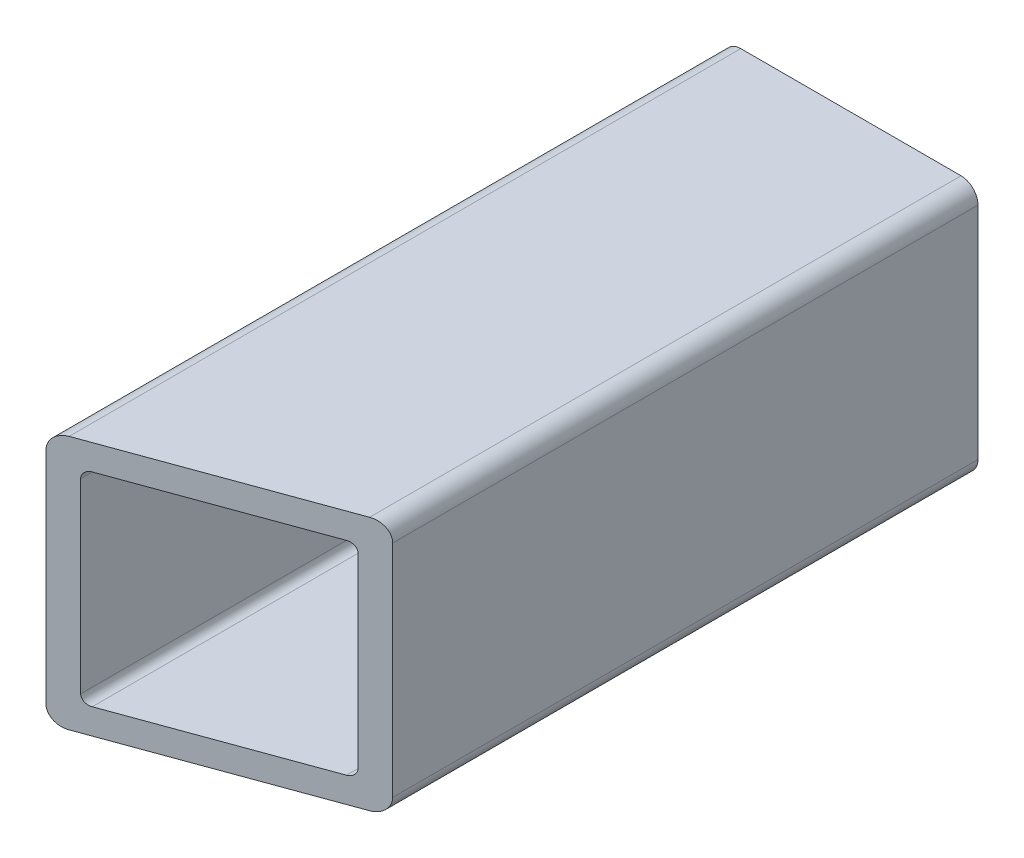
ISO-10303-21;
HEADER;
FILE_DESCRIPTION(('STEP AP214'),'2;1');
FILE_NAME('part.step','',(''),(''),'','','');
FILE_SCHEMA(('AUTOMOTIVE_DESIGN { 1 0 10303 214 1 1 1 1 }'));
ENDSEC;
DATA;
#1=APPLICATION_CONTEXT('core data for automotive mechanical design processes');
#2=APPLICATION_PROTOCOL_DEFINITION('international standard','automotive_design',2000,#1);
#3=PRODUCT_CONTEXT('',#1,'mechanical');
#4=PRODUCT('Part','Part','',(#3));
#5=PRODUCT_RELATED_PRODUCT_CATEGORY('part','',(#4));
#6=PRODUCT_DEFINITION_FORMATION('','',#4);
#7=PRODUCT_DEFINITION_CONTEXT('part definition',#1,'design');
#8=PRODUCT_DEFINITION('design','',#6,#7);
#9=PRODUCT_DEFINITION_SHAPE('','',#8);
#10=(LENGTH_UNIT() NAMED_UNIT(*) SI_UNIT(.MILLI.,.METRE.));
#11=(NAMED_UNIT(*) PLANE_ANGLE_UNIT() SI_UNIT($,.RADIAN.));
#12=(NAMED_UNIT(*) SI_UNIT($,.STERADIAN.) SOLID_ANGLE_UNIT());
#13=UNCERTAINTY_MEASURE_WITH_UNIT(LENGTH_MEASURE(1.E-05),#10,'distance_accuracy_value','');
#14=(GEOMETRIC_REPRESENTATION_CONTEXT(3) GLOBAL_UNCERTAINTY_ASSIGNED_CONTEXT((#13)) GLOBAL_UNIT_ASSIGNED_CONTEXT((#10,
#11,#12)) REPRESENTATION_CONTEXT('',''));
#15=CARTESIAN_POINT('',(0.,0.,0.));
#16=DIRECTION('',(0.,0.,1.));
#17=DIRECTION('',(1.,0.,0.));
#18=AXIS2_PLACEMENT_3D('',#15,#16,#17);
#19=CARTESIAN_POINT('',(-13.,-0.999999999999999,0.));
#20=DIRECTION('',(0.,0.,1.));
#21=DIRECTION('',(1.,0.,0.));
#22=AXIS2_PLACEMENT_3D('',#19,#20,#21);
#23=PLANE('',#22);
#24=CARTESIAN_POINT('',(-13.,-0.999999999999999,0.));
#25=DIRECTION('',(0.,0.,1.));
#26=DIRECTION('',(1.,0.,0.));
#27=AXIS2_PLACEMENT_3D('',#24,#25,#26);
#28=CIRCLE('',#27,2.);
#29=CARTESIAN_POINT('',(-15.,-0.999999999999999,0.));
#30=VERTEX_POINT('',#29);
#31=CARTESIAN_POINT('',(-13.,-3.,0.));
#32=VERTEX_POINT('',#31);
#33=EDGE_CURVE('E172',#30,#32,#28,.T.);
#34=ORIENTED_EDGE('',*,*,#33,.F.);
#35=DIRECTION('',(0.,-1.,0.));
#36=VECTOR('',#35,1.);
#37=CARTESIAN_POINT('',(-15.,-0.999999999999999,0.));
#38=LINE('',#37,#36);
#39=CARTESIAN_POINT('',(-15.,25.,0.));
#40=VERTEX_POINT('',#39);
#41=EDGE_CURVE('E188',#40,#30,#38,.T.);
#42=ORIENTED_EDGE('',*,*,#41,.F.);
#43=CARTESIAN_POINT('',(-13.,25.,0.));
#44=DIRECTION('',(0.,0.,1.));
#45=DIRECTION('',(1.,0.,0.));
#46=AXIS2_PLACEMENT_3D('',#43,#44,#45);
#47=CIRCLE('',#46,2.);
#48=CARTESIAN_POINT('',(-13.,27.,0.));
#49=VERTEX_POINT('',#48);
#50=EDGE_CURVE('E190',#49,#40,#47,.T.);
#51=ORIENTED_EDGE('',*,*,#50,.F.);
#52=DIRECTION('',(-1.,0.,0.));
#53=VECTOR('',#52,1.);
#54=CARTESIAN_POINT('',(-13.,27.,0.));
#55=LINE('',#54,#53);
#56=CARTESIAN_POINT('',(13.,27.,0.));
#57=VERTEX_POINT('',#56);
#58=EDGE_CURVE('E192',#57,#49,#55,.T.);
#59=ORIENTED_EDGE('',*,*,#58,.F.);
#60=CARTESIAN_POINT('',(13.,25.,0.));
#61=DIRECTION('',(0.,0.,1.));
#62=DIRECTION('',(1.,0.,0.));
#63=AXIS2_PLACEMENT_3D('',#60,#61,#62);
#64=CIRCLE('',#63,2.);
#65=CARTESIAN_POINT('',(15.,25.,0.));
#66=VERTEX_POINT('',#65);
#67=EDGE_CURVE('E195',#66,#57,#64,.T.);
#68=ORIENTED_EDGE('',*,*,#67,.F.);
#69=DIRECTION('',(0.,1.,0.));
#70=VECTOR('',#69,1.);
#71=CARTESIAN_POINT('',(15.,-0.999999999999999,0.));
#72=LINE('',#71,#70);
#73=CARTESIAN_POINT('',(15.,-0.999999999999999,0.));
#74=VERTEX_POINT('',#73);
#75=EDGE_CURVE('E198',#74,#66,#72,.T.);
#76=ORIENTED_EDGE('',*,*,#75,.F.);
#77=CARTESIAN_POINT('',(13.,-0.999999999999999,0.));
#78=DIRECTION('',(0.,0.,1.));
#79=DIRECTION('',(1.,0.,0.));
#80=AXIS2_PLACEMENT_3D('',#77,#78,#79);
#81=CIRCLE('',#80,2.);
#82=CARTESIAN_POINT('',(13.,-3.,0.));
#83=VERTEX_POINT('',#82);
#84=EDGE_CURVE('E201',#83,#74,#81,.T.);
#85=ORIENTED_EDGE('',*,*,#84,.F.);
#86=DIRECTION('',(1.,0.,0.));
#87=VECTOR('',#86,1.);
#88=CARTESIAN_POINT('',(-13.,-3.,0.));
#89=LINE('',#88,#87);
#90=EDGE_CURVE('E204',#32,#83,#89,.T.);
#91=ORIENTED_EDGE('',*,*,#90,.F.);
#92=EDGE_LOOP('',(#34,#42,#51,#59,#68,#76,#85,#91));
#93=FACE_BOUND('',#92,.T.);
#94=CARTESIAN_POINT('',(-11.,1.,0.));
#95=DIRECTION('',(0.,0.,1.));
#96=DIRECTION('',(1.,0.,0.));
#97=AXIS2_PLACEMENT_3D('',#94,#95,#96);
#98=CIRCLE('',#97,1.);
#99=CARTESIAN_POINT('',(-12.,1.,0.));
#100=VERTEX_POINT('',#99);
#101=CARTESIAN_POINT('',(-11.,0.,0.));
#102=VERTEX_POINT('',#101);
#103=EDGE_CURVE('E159',#100,#102,#98,.T.);
#104=ORIENTED_EDGE('',*,*,#103,.T.);
#105=DIRECTION('',(1.,0.,0.));
#106=VECTOR('',#105,1.);
#107=CARTESIAN_POINT('',(-11.,0.,0.));
#108=LINE('',#107,#106);
#109=CARTESIAN_POINT('',(11.,0.,0.));
#110=VERTEX_POINT('',#109);
#111=EDGE_CURVE('E241',#102,#110,#108,.T.);
#112=ORIENTED_EDGE('',*,*,#111,.T.);
#113=CARTESIAN_POINT('',(11.,1.,0.));
#114=DIRECTION('',(0.,0.,1.));
#115=DIRECTION('',(1.,0.,0.));
#116=AXIS2_PLACEMENT_3D('',#113,#114,#115);
#117=CIRCLE('',#116,1.);
#118=CARTESIAN_POINT('',(12.,1.,0.));
#119=VERTEX_POINT('',#118);
#120=EDGE_CURVE('E238',#110,#119,#117,.T.);
#121=ORIENTED_EDGE('',*,*,#120,.T.);
#122=DIRECTION('',(0.,1.,0.));
#123=VECTOR('',#122,1.);
#124=CARTESIAN_POINT('',(12.,1.,0.));
#125=LINE('',#124,#123);
#126=CARTESIAN_POINT('',(12.,23.,0.));
#127=VERTEX_POINT('',#126);
#128=EDGE_CURVE('E235',#119,#127,#125,.T.);
#129=ORIENTED_EDGE('',*,*,#128,.T.);
#130=CARTESIAN_POINT('',(11.,23.,0.));
#131=DIRECTION('',(0.,0.,1.));
#132=DIRECTION('',(1.,0.,0.));
#133=AXIS2_PLACEMENT_3D('',#130,#131,#132);
#134=CIRCLE('',#133,1.);
#135=CARTESIAN_POINT('',(11.,24.,0.));
#136=VERTEX_POINT('',#135);
#137=EDGE_CURVE('E232',#127,#136,#134,.T.);
#138=ORIENTED_EDGE('',*,*,#137,.T.);
#139=DIRECTION('',(-1.,0.,0.));
#140=VECTOR('',#139,1.);
#141=CARTESIAN_POINT('',(-11.,24.,0.));
#142=LINE('',#141,#140);
#143=CARTESIAN_POINT('',(-11.,24.,0.));
#144=VERTEX_POINT('',#143);
#145=EDGE_CURVE('E229',#136,#144,#142,.T.);
#146=ORIENTED_EDGE('',*,*,#145,.T.);
#147=CARTESIAN_POINT('',(-11.,23.,0.));
#148=DIRECTION('',(0.,0.,1.));
#149=DIRECTION('',(1.,0.,0.));
#150=AXIS2_PLACEMENT_3D('',#147,#148,#149);
#151=CIRCLE('',#150,1.);
#152=CARTESIAN_POINT('',(-12.,23.,0.));
#153=VERTEX_POINT('',#152);
#154=EDGE_CURVE('E226',#144,#153,#151,.T.);
#155=ORIENTED_EDGE('',*,*,#154,.T.);
#156=DIRECTION('',(0.,-1.,0.));
#157=VECTOR('',#156,1.);
#158=CARTESIAN_POINT('',(-12.,1.,0.));
#159=LINE('',#158,#157);
#160=EDGE_CURVE('E223',#153,#100,#159,.T.);
#161=ORIENTED_EDGE('',*,*,#160,.T.);
#162=EDGE_LOOP('',(#104,#112,#121,#129,#138,#146,#155,#161));
#163=FACE_BOUND('',#162,.T.);
#164=ADVANCED_FACE('F36',(#93,#163),#23,.F.);
#165=CARTESIAN_POINT('',(-13.,-0.999999999999999,80.));
#166=DIRECTION('',(0.,0.,-1.));
#167=DIRECTION('',(-1.,0.,0.));
#168=AXIS2_PLACEMENT_3D('',#165,#166,#167);
#169=CYLINDRICAL_SURFACE('',#168,2.);
#170=DIRECTION('',(0.,0.,-1.));
#171=VECTOR('',#170,1.);
#172=CARTESIAN_POINT('',(-13.,-3.,80.));
#173=LINE('',#172,#171);
#174=CARTESIAN_POINT('',(-13.,-3.,79.2720595314676));
#175=VERTEX_POINT('',#174);
#176=EDGE_CURVE('E44',#175,#32,#173,.T.);
#177=ORIENTED_EDGE('',*,*,#176,.F.);
#178=CARTESIAN_POINT('',(-13.,-0.999999999999999,79.2720595314676));
#179=DIRECTION('',(-0.342020143325669,0.,-0.939692620785908));
#180=DIRECTION('',(0.939692620785908,0.,-0.342020143325669));
#181=AXIS2_PLACEMENT_3D('',#178,#179,#180);
#182=ELLIPSE('',#181,2.12835554495182,2.);
#183=CARTESIAN_POINT('',(-15.,-1.,80.));
#184=VERTEX_POINT('',#183);
#185=EDGE_CURVE('E148',#175,#184,#182,.T.);
#186=ORIENTED_EDGE('',*,*,#185,.T.);
#187=DIRECTION('',(0.,0.,-1.));
#188=VECTOR('',#187,1.);
#189=CARTESIAN_POINT('',(-15.,-0.999999999999999,80.));
#190=LINE('',#189,#188);
#191=EDGE_CURVE('E186',#184,#30,#190,.T.);
#192=ORIENTED_EDGE('',*,*,#191,.T.);
#193=ORIENTED_EDGE('',*,*,#33,.T.);
#194=EDGE_LOOP('',(#177,#186,#192,#193));
#195=FACE_BOUND('',#194,.T.);
#196=ADVANCED_FACE('F38',(#195),#169,.T.);
#197=CARTESIAN_POINT('',(-13.,-3.,80.));
#198=DIRECTION('',(0.,1.,0.));
#199=DIRECTION('',(0.,0.,1.));
#200=AXIS2_PLACEMENT_3D('',#197,#198,#199);
#201=PLANE('',#200);
#202=DIRECTION('',(0.,0.,-1.));
#203=VECTOR('',#202,1.);
#204=CARTESIAN_POINT('',(13.,-3.,80.));
#205=LINE('',#204,#203);
#206=CARTESIAN_POINT('',(13.,-3.,69.8088334405463));
#207=VERTEX_POINT('',#206);
#208=EDGE_CURVE('E167',#207,#83,#205,.T.);
#209=ORIENTED_EDGE('',*,*,#208,.F.);
#210=DIRECTION('',(0.939692620785908,0.,-0.342020143325669));
#211=VECTOR('',#210,1.);
#212=CARTESIAN_POINT('',(-15.,-3.,80.));
#213=LINE('',#212,#211);
#214=EDGE_CURVE('E151',#175,#207,#213,.T.);
#215=ORIENTED_EDGE('',*,*,#214,.F.);
#216=ORIENTED_EDGE('',*,*,#176,.T.);
#217=ORIENTED_EDGE('',*,*,#90,.T.);
#218=EDGE_LOOP('',(#209,#215,#216,#217));
#219=FACE_BOUND('',#218,.T.);
#220=ADVANCED_FACE('F164',(#219),#201,.F.);
#221=CARTESIAN_POINT('',(13.,-0.999999999999999,80.));
#222=DIRECTION('',(0.,0.,-1.));
#223=DIRECTION('',(-1.,0.,0.));
#224=AXIS2_PLACEMENT_3D('',#221,#222,#223);
#225=CYLINDRICAL_SURFACE('',#224,2.);
#226=DIRECTION('',(0.,0.,-1.));
#227=VECTOR('',#226,1.);
#228=CARTESIAN_POINT('',(15.,-0.999999999999999,80.));
#229=LINE('',#228,#227);
#230=CARTESIAN_POINT('',(15.,-0.999999999999999,69.0808929720139));
#231=VERTEX_POINT('',#230);
#232=EDGE_CURVE('E173',#231,#74,#229,.T.);
#233=ORIENTED_EDGE('',*,*,#232,.F.);
#234=CARTESIAN_POINT('',(13.,-0.999999999999999,69.8088334405463));
#235=DIRECTION('',(-0.342020143325669,0.,-0.939692620785908));
#236=DIRECTION('',(0.939692620785908,0.,-0.342020143325669));
#237=AXIS2_PLACEMENT_3D('',#234,#235,#236);
#238=ELLIPSE('',#237,2.12835554495183,2.);
#239=EDGE_CURVE('E160',#231,#207,#238,.T.);
#240=ORIENTED_EDGE('',*,*,#239,.T.);
#241=ORIENTED_EDGE('',*,*,#208,.T.);
#242=ORIENTED_EDGE('',*,*,#84,.T.);
#243=EDGE_LOOP('',(#233,#240,#241,#242));
#244=FACE_BOUND('',#243,.T.);
#245=ADVANCED_FACE('F341',(#244),#225,.T.);
#246=CARTESIAN_POINT('',(15.,-0.999999999999999,80.));
#247=DIRECTION('',(-1.,0.,0.));
#248=DIRECTION('',(0.,0.,1.));
#249=AXIS2_PLACEMENT_3D('',#246,#247,#248);
#250=PLANE('',#249);
#251=DIRECTION('',(0.,0.,-1.));
#252=VECTOR('',#251,1.);
#253=CARTESIAN_POINT('',(15.,25.,80.));
#254=LINE('',#253,#252);
#255=CARTESIAN_POINT('',(15.,25.,69.0808929720139));
#256=VERTEX_POINT('',#255);
#257=EDGE_CURVE('E177',#256,#66,#254,.T.);
#258=ORIENTED_EDGE('',*,*,#257,.F.);
#259=DIRECTION('',(0.,-1.,0.));
#260=VECTOR('',#259,1.);
#261=CARTESIAN_POINT('',(15.,-0.999999999999999,69.0808929720139));
#262=LINE('',#261,#260);
#263=EDGE_CURVE('E247',#256,#231,#262,.T.);
#264=ORIENTED_EDGE('',*,*,#263,.T.);
#265=ORIENTED_EDGE('',*,*,#232,.T.);
#266=ORIENTED_EDGE('',*,*,#75,.T.);
#267=EDGE_LOOP('',(#258,#264,#265,#266));
#268=FACE_BOUND('',#267,.T.);
#269=ADVANCED_FACE('F337',(#268),#250,.F.);
#270=CARTESIAN_POINT('',(13.,25.,80.));
#271=DIRECTION('',(0.,0.,-1.));
#272=DIRECTION('',(-1.,0.,0.));
#273=AXIS2_PLACEMENT_3D('',#270,#271,#272);
#274=CYLINDRICAL_SURFACE('',#273,2.);
#275=DIRECTION('',(0.,0.,-1.));
#276=VECTOR('',#275,1.);
#277=CARTESIAN_POINT('',(13.,27.,80.));
#278=LINE('',#277,#276);
#279=CARTESIAN_POINT('',(13.,27.,69.8088334405463));
#280=VERTEX_POINT('',#279);
#281=EDGE_CURVE('E179',#280,#57,#278,.T.);
#282=ORIENTED_EDGE('',*,*,#281,.F.);
#283=CARTESIAN_POINT('',(13.,25.,69.8088334405463));
#284=DIRECTION('',(-0.342020143325669,0.,-0.939692620785908));
#285=DIRECTION('',(0.939692620785908,0.,-0.342020143325669));
#286=AXIS2_PLACEMENT_3D('',#283,#284,#285);
#287=ELLIPSE('',#286,2.12835554495183,2.);
#288=EDGE_CURVE('E250',#280,#256,#287,.T.);
#289=ORIENTED_EDGE('',*,*,#288,.T.);
#290=ORIENTED_EDGE('',*,*,#257,.T.);
#291=ORIENTED_EDGE('',*,*,#67,.T.);
#292=EDGE_LOOP('',(#282,#289,#290,#291));
#293=FACE_BOUND('',#292,.T.);
#294=ADVANCED_FACE('F333',(#293),#274,.T.);
#295=CARTESIAN_POINT('',(-13.,27.,80.));
#296=DIRECTION('',(0.,-1.,0.));
#297=DIRECTION('',(0.,0.,-1.));
#298=AXIS2_PLACEMENT_3D('',#295,#296,#297);
#299=PLANE('',#298);
#300=DIRECTION('',(0.,0.,-1.));
#301=VECTOR('',#300,1.);
#302=CARTESIAN_POINT('',(-13.,27.,80.));
#303=LINE('',#302,#301);
#304=CARTESIAN_POINT('',(-13.,27.,79.2720595314676));
#305=VERTEX_POINT('',#304);
#306=EDGE_CURVE('E181',#305,#49,#303,.T.);
#307=ORIENTED_EDGE('',*,*,#306,.F.);
#308=DIRECTION('',(0.939692620785908,0.,-0.342020143325669));
#309=VECTOR('',#308,1.);
#310=CARTESIAN_POINT('',(-13.233955556881,27.,79.3572123903135));
#311=LINE('',#310,#309);
#312=EDGE_CURVE('E253',#305,#280,#311,.T.);
#313=ORIENTED_EDGE('',*,*,#312,.T.);
#314=ORIENTED_EDGE('',*,*,#281,.T.);
#315=ORIENTED_EDGE('',*,*,#58,.T.);
#316=EDGE_LOOP('',(#307,#313,#314,#315));
#317=FACE_BOUND('',#316,.T.);
#318=ADVANCED_FACE('F329',(#317),#299,.F.);
#319=CARTESIAN_POINT('',(-13.,25.,80.));
#320=DIRECTION('',(0.,0.,-1.));
#321=DIRECTION('',(-1.,0.,0.));
#322=AXIS2_PLACEMENT_3D('',#319,#320,#321);
#323=CYLINDRICAL_SURFACE('',#322,2.);
#324=DIRECTION('',(0.,0.,-1.));
#325=VECTOR('',#324,1.);
#326=CARTESIAN_POINT('',(-15.,25.,80.));
#327=LINE('',#326,#325);
#328=CARTESIAN_POINT('',(-15.,25.,80.));
#329=VERTEX_POINT('',#328);
#330=EDGE_CURVE('E183',#329,#40,#327,.T.);
#331=ORIENTED_EDGE('',*,*,#330,.F.);
#332=CARTESIAN_POINT('',(-13.,25.,79.2720595314676));
#333=DIRECTION('',(-0.342020143325669,0.,-0.939692620785908));
#334=DIRECTION('',(0.939692620785908,0.,-0.342020143325669));
#335=AXIS2_PLACEMENT_3D('',#332,#333,#334);
#336=ELLIPSE('',#335,2.12835554495183,2.);
#337=EDGE_CURVE('E256',#329,#305,#336,.T.);
#338=ORIENTED_EDGE('',*,*,#337,.T.);
#339=ORIENTED_EDGE('',*,*,#306,.T.);
#340=ORIENTED_EDGE('',*,*,#50,.T.);
#341=EDGE_LOOP('',(#331,#338,#339,#340));
#342=FACE_BOUND('',#341,.T.);
#343=ADVANCED_FACE('F325',(#342),#323,.T.);
#344=CARTESIAN_POINT('',(-15.,-0.999999999999999,80.));
#345=DIRECTION('',(1.,0.,0.));
#346=DIRECTION('',(0.,0.,-1.));
#347=AXIS2_PLACEMENT_3D('',#344,#345,#346);
#348=PLANE('',#347);
#349=ORIENTED_EDGE('',*,*,#41,.T.);
#350=ORIENTED_EDGE('',*,*,#191,.F.);
#351=DIRECTION('',(0.,-1.,0.));
#352=VECTOR('',#351,1.);
#353=CARTESIAN_POINT('',(-15.,-0.999999999999999,80.));
#354=LINE('',#353,#352);
#355=EDGE_CURVE('E154',#329,#184,#354,.T.);
#356=ORIENTED_EDGE('',*,*,#355,.F.);
#357=ORIENTED_EDGE('',*,*,#330,.T.);
#358=EDGE_LOOP('',(#349,#350,#356,#357));
#359=FACE_BOUND('',#358,.T.);
#360=ADVANCED_FACE('F322',(#359),#348,.F.);
#361=CARTESIAN_POINT('',(-11.,1.,80.));
#362=DIRECTION('',(0.,0.,-1.));
#363=DIRECTION('',(-1.,0.,0.));
#364=AXIS2_PLACEMENT_3D('',#361,#362,#363);
#365=CYLINDRICAL_SURFACE('',#364,1.);
#366=CARTESIAN_POINT('',(-11.,1.,78.5441190629352));
#367=DIRECTION('',(-0.342020143325669,0.,-0.939692620785908));
#368=DIRECTION('',(0.939692620785908,0.,-0.342020143325669));
#369=AXIS2_PLACEMENT_3D('',#366,#367,#368);
#370=ELLIPSE('',#369,1.06417777247591,1.);
#371=CARTESIAN_POINT('',(-11.,0.,78.5441190629352));
#372=VERTEX_POINT('',#371);
#373=CARTESIAN_POINT('',(-12.,1.,78.9080892972014));
#374=VERTEX_POINT('',#373);
#375=EDGE_CURVE('E50',#372,#374,#370,.T.);
#376=ORIENTED_EDGE('',*,*,#375,.F.);
#377=DIRECTION('',(0.,0.,-1.));
#378=VECTOR('',#377,1.);
#379=CARTESIAN_POINT('',(-11.,0.,80.));
#380=LINE('',#379,#378);
#381=EDGE_CURVE('E207',#372,#102,#380,.T.);
#382=ORIENTED_EDGE('',*,*,#381,.T.);
#383=ORIENTED_EDGE('',*,*,#103,.F.);
#384=DIRECTION('',(0.,0.,-1.));
#385=VECTOR('',#384,1.);
#386=CARTESIAN_POINT('',(-12.,1.,80.));
#387=LINE('',#386,#385);
#388=EDGE_CURVE('E57',#374,#100,#387,.T.);
#389=ORIENTED_EDGE('',*,*,#388,.F.);
#390=EDGE_LOOP('',(#376,#382,#383,#389));
#391=FACE_BOUND('',#390,.T.);
#392=ADVANCED_FACE('F303',(#391),#365,.F.);
#393=CARTESIAN_POINT('',(-11.,0.,80.));
#394=DIRECTION('',(0.,1.,0.));
#395=DIRECTION('',(-1.,0.,0.));
#396=AXIS2_PLACEMENT_3D('',#393,#394,#395);
#397=PLANE('',#396);
#398=DIRECTION('',(-0.939692620785908,0.,0.342020143325669));
#399=VECTOR('',#398,1.);
#400=CARTESIAN_POINT('',(-11.467911113762,0.,78.7144247806269));
#401=LINE('',#400,#399);
#402=CARTESIAN_POINT('',(11.,0.,70.5367739090787));
#403=VERTEX_POINT('',#402);
#404=EDGE_CURVE('E260',#403,#372,#401,.T.);
#405=ORIENTED_EDGE('',*,*,#404,.F.);
#406=DIRECTION('',(0.,0.,-1.));
#407=VECTOR('',#406,1.);
#408=CARTESIAN_POINT('',(11.,0.,80.));
#409=LINE('',#408,#407);
#410=EDGE_CURVE('E210',#403,#110,#409,.T.);
#411=ORIENTED_EDGE('',*,*,#410,.T.);
#412=ORIENTED_EDGE('',*,*,#111,.F.);
#413=ORIENTED_EDGE('',*,*,#381,.F.);
#414=EDGE_LOOP('',(#405,#411,#412,#413));
#415=FACE_BOUND('',#414,.T.);
#416=ADVANCED_FACE('F300',(#415),#397,.T.);
#417=CARTESIAN_POINT('',(11.,1.,80.));
#418=DIRECTION('',(0.,0.,-1.));
#419=DIRECTION('',(-1.,0.,0.));
#420=AXIS2_PLACEMENT_3D('',#417,#418,#419);
#421=CYLINDRICAL_SURFACE('',#420,1.);
#422=CARTESIAN_POINT('',(11.,1.,70.5367739090787));
#423=DIRECTION('',(-0.342020143325669,0.,-0.939692620785908));
#424=DIRECTION('',(0.939692620785908,0.,-0.342020143325669));
#425=AXIS2_PLACEMENT_3D('',#422,#423,#424);
#426=ELLIPSE('',#425,1.06417777247591,1.);
#427=CARTESIAN_POINT('',(12.,1.,70.1728036748125));
#428=VERTEX_POINT('',#427);
#429=EDGE_CURVE('E262',#428,#403,#426,.T.);
#430=ORIENTED_EDGE('',*,*,#429,.F.);
#431=DIRECTION('',(0.,0.,-1.));
#432=VECTOR('',#431,1.);
#433=CARTESIAN_POINT('',(12.,1.,80.));
#434=LINE('',#433,#432);
#435=EDGE_CURVE('E212',#428,#119,#434,.T.);
#436=ORIENTED_EDGE('',*,*,#435,.T.);
#437=ORIENTED_EDGE('',*,*,#120,.F.);
#438=ORIENTED_EDGE('',*,*,#410,.F.);
#439=EDGE_LOOP('',(#430,#436,#437,#438));
#440=FACE_BOUND('',#439,.T.);
#441=ADVANCED_FACE('F295',(#440),#421,.F.);
#442=CARTESIAN_POINT('',(12.,1.,80.));
#443=DIRECTION('',(-1.,0.,0.));
#444=DIRECTION('',(0.,-1.,0.));
#445=AXIS2_PLACEMENT_3D('',#442,#443,#444);
#446=PLANE('',#445);
#447=DIRECTION('',(0.,-1.,0.));
#448=VECTOR('',#447,1.);
#449=CARTESIAN_POINT('',(12.,1.00000000000001,70.1728036748125));
#450=LINE('',#449,#448);
#451=CARTESIAN_POINT('',(12.,23.,70.1728036748125));
#452=VERTEX_POINT('',#451);
#453=EDGE_CURVE('E264',#452,#428,#450,.T.);
#454=ORIENTED_EDGE('',*,*,#453,.F.);
#455=DIRECTION('',(0.,0.,-1.));
#456=VECTOR('',#455,1.);
#457=CARTESIAN_POINT('',(12.,23.,80.));
#458=LINE('',#457,#456);
#459=EDGE_CURVE('E214',#452,#127,#458,.T.);
#460=ORIENTED_EDGE('',*,*,#459,.T.);
#461=ORIENTED_EDGE('',*,*,#128,.F.);
#462=ORIENTED_EDGE('',*,*,#435,.F.);
#463=EDGE_LOOP('',(#454,#460,#461,#462));
#464=FACE_BOUND('',#463,.T.);
#465=ADVANCED_FACE('F292',(#464),#446,.T.);
#466=CARTESIAN_POINT('',(11.,23.,80.));
#467=DIRECTION('',(0.,0.,-1.));
#468=DIRECTION('',(-1.,0.,0.));
#469=AXIS2_PLACEMENT_3D('',#466,#467,#468);
#470=CYLINDRICAL_SURFACE('',#469,1.);
#471=CARTESIAN_POINT('',(11.,23.,70.5367739090787));
#472=DIRECTION('',(-0.342020143325669,0.,-0.939692620785908));
#473=DIRECTION('',(0.939692620785908,0.,-0.342020143325669));
#474=AXIS2_PLACEMENT_3D('',#471,#472,#473);
#475=ELLIPSE('',#474,1.06417777247592,1.);
#476=CARTESIAN_POINT('',(11.,24.,70.5367739090787));
#477=VERTEX_POINT('',#476);
#478=EDGE_CURVE('E266',#477,#452,#475,.T.);
#479=ORIENTED_EDGE('',*,*,#478,.F.);
#480=DIRECTION('',(0.,0.,-1.));
#481=VECTOR('',#480,1.);
#482=CARTESIAN_POINT('',(11.,24.,80.));
#483=LINE('',#482,#481);
#484=EDGE_CURVE('E216',#477,#136,#483,.T.);
#485=ORIENTED_EDGE('',*,*,#484,.T.);
#486=ORIENTED_EDGE('',*,*,#137,.F.);
#487=ORIENTED_EDGE('',*,*,#459,.F.);
#488=EDGE_LOOP('',(#479,#485,#486,#487));
#489=FACE_BOUND('',#488,.T.);
#490=ADVANCED_FACE('F287',(#489),#470,.F.);
#491=CARTESIAN_POINT('',(-11.,24.,80.));
#492=DIRECTION('',(0.,-1.,0.));
#493=DIRECTION('',(1.,0.,0.));
#494=AXIS2_PLACEMENT_3D('',#491,#492,#493);
#495=PLANE('',#494);
#496=DIRECTION('',(0.939692620785908,0.,-0.342020143325669));
#497=VECTOR('',#496,1.);
#498=CARTESIAN_POINT('',(-11.467911113762,24.,78.7144247806269));
#499=LINE('',#498,#497);
#500=CARTESIAN_POINT('',(-11.,24.,78.5441190629352));
#501=VERTEX_POINT('',#500);
#502=EDGE_CURVE('E268',#501,#477,#499,.T.);
#503=ORIENTED_EDGE('',*,*,#502,.F.);
#504=DIRECTION('',(0.,0.,-1.));
#505=VECTOR('',#504,1.);
#506=CARTESIAN_POINT('',(-11.,24.,80.));
#507=LINE('',#506,#505);
#508=EDGE_CURVE('E218',#501,#144,#507,.T.);
#509=ORIENTED_EDGE('',*,*,#508,.T.);
#510=ORIENTED_EDGE('',*,*,#145,.F.);
#511=ORIENTED_EDGE('',*,*,#484,.F.);
#512=EDGE_LOOP('',(#503,#509,#510,#511));
#513=FACE_BOUND('',#512,.T.);
#514=ADVANCED_FACE('F278',(#513),#495,.T.);
#515=CARTESIAN_POINT('',(-11.,23.,80.));
#516=DIRECTION('',(0.,0.,-1.));
#517=DIRECTION('',(-1.,0.,0.));
#518=AXIS2_PLACEMENT_3D('',#515,#516,#517);
#519=CYLINDRICAL_SURFACE('',#518,1.);
#520=CARTESIAN_POINT('',(-11.,23.,78.5441190629352));
#521=DIRECTION('',(-0.342020143325669,0.,-0.939692620785908));
#522=DIRECTION('',(0.939692620785908,0.,-0.342020143325669));
#523=AXIS2_PLACEMENT_3D('',#520,#521,#522);
#524=ELLIPSE('',#523,1.06417777247592,1.);
#525=CARTESIAN_POINT('',(-12.,23.,78.9080892972014));
#526=VERTEX_POINT('',#525);
#527=EDGE_CURVE('E168',#526,#501,#524,.T.);
#528=ORIENTED_EDGE('',*,*,#527,.F.);
#529=DIRECTION('',(0.,0.,-1.));
#530=VECTOR('',#529,1.);
#531=CARTESIAN_POINT('',(-12.,23.,80.));
#532=LINE('',#531,#530);
#533=EDGE_CURVE('E220',#526,#153,#532,.T.);
#534=ORIENTED_EDGE('',*,*,#533,.T.);
#535=ORIENTED_EDGE('',*,*,#154,.F.);
#536=ORIENTED_EDGE('',*,*,#508,.F.);
#537=EDGE_LOOP('',(#528,#534,#535,#536));
#538=FACE_BOUND('',#537,.T.);
#539=ADVANCED_FACE('F281',(#538),#519,.F.);
#540=CARTESIAN_POINT('',(-12.,1.,80.));
#541=DIRECTION('',(1.,0.,0.));
#542=DIRECTION('',(0.,0.,-1.));
#543=AXIS2_PLACEMENT_3D('',#540,#541,#542);
#544=PLANE('',#543);
#545=DIRECTION('',(0.,1.,0.));
#546=VECTOR('',#545,1.);
#547=CARTESIAN_POINT('',(-12.,1.,78.9080892972014));
#548=LINE('',#547,#546);
#549=EDGE_CURVE('E11',#374,#526,#548,.T.);
#550=ORIENTED_EDGE('',*,*,#549,.F.);
#551=ORIENTED_EDGE('',*,*,#388,.T.);
#552=ORIENTED_EDGE('',*,*,#160,.F.);
#553=ORIENTED_EDGE('',*,*,#533,.F.);
#554=EDGE_LOOP('',(#550,#551,#552,#553));
#555=FACE_BOUND('',#554,.T.);
#556=ADVANCED_FACE('F304',(#555),#544,.T.);
#557=CARTESIAN_POINT('',(-15.,67.,80.));
#558=DIRECTION('',(-0.342020143325669,0.,-0.939692620785908));
#559=DIRECTION('',(-0.939692620785908,0.,0.342020143325669));
#560=AXIS2_PLACEMENT_3D('',#557,#558,#559);
#561=PLANE('',#560);
#562=ORIENTED_EDGE('',*,*,#375,.T.);
#563=ORIENTED_EDGE('',*,*,#549,.T.);
#564=ORIENTED_EDGE('',*,*,#527,.T.);
#565=ORIENTED_EDGE('',*,*,#502,.T.);
#566=ORIENTED_EDGE('',*,*,#478,.T.);
#567=ORIENTED_EDGE('',*,*,#453,.T.);
#568=ORIENTED_EDGE('',*,*,#429,.T.);
#569=ORIENTED_EDGE('',*,*,#404,.T.);
#570=EDGE_LOOP('',(#562,#563,#564,#565,#566,#567,#568,#569));
#571=FACE_BOUND('',#570,.T.);
#572=ORIENTED_EDGE('',*,*,#214,.T.);
#573=ORIENTED_EDGE('',*,*,#239,.F.);
#574=ORIENTED_EDGE('',*,*,#263,.F.);
#575=ORIENTED_EDGE('',*,*,#288,.F.);
#576=ORIENTED_EDGE('',*,*,#312,.F.);
#577=ORIENTED_EDGE('',*,*,#337,.F.);
#578=ORIENTED_EDGE('',*,*,#355,.T.);
#579=ORIENTED_EDGE('',*,*,#185,.F.);
#580=EDGE_LOOP('',(#572,#573,#574,#575,#576,#577,#578,#579));
#581=FACE_BOUND('',#580,.T.);
#582=ADVANCED_FACE('F150',(#571,#581),#561,.F.);
#583=CLOSED_SHELL('',(#164,#196,#220,#245,#269,#294,#318,#343,#360,#392,#416,#441,#465,#490,
#514,#539,#556,#582));
#584=MANIFOLD_SOLID_BREP('B2',#583);
#585=ADVANCED_BREP_SHAPE_REPRESENTATION('',(#18,#584),#14);
#586=SHAPE_DEFINITION_REPRESENTATION(#9,#585);
ENDSEC;
END-ISO-10303-21;
